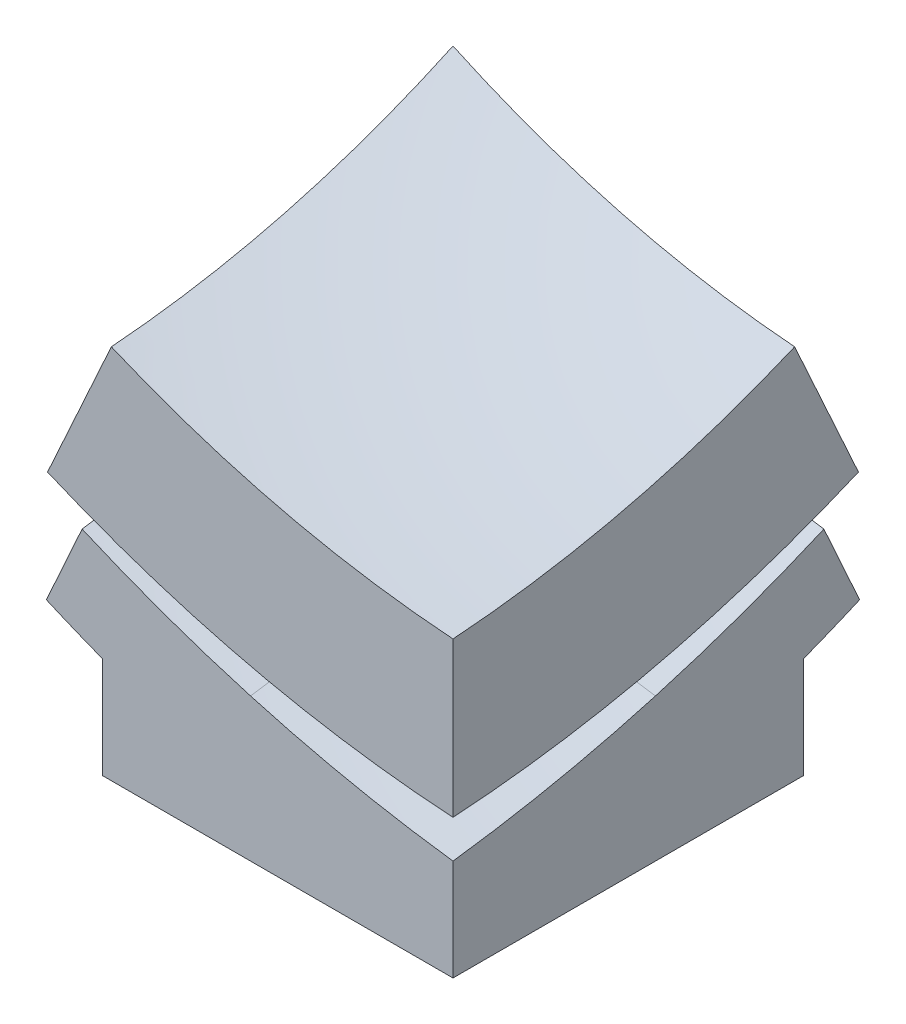
ISO-10303-21;
HEADER;
FILE_DESCRIPTION(('STEP AP214'),'2;1');
FILE_NAME('part.step','',(''),(''),'','','');
FILE_SCHEMA(('AUTOMOTIVE_DESIGN { 1 0 10303 214 1 1 1 1 }'));
ENDSEC;
DATA;
#1=APPLICATION_CONTEXT('core data for automotive mechanical design processes');
#2=APPLICATION_PROTOCOL_DEFINITION('international standard','automotive_design',2000,#1);
#3=PRODUCT_CONTEXT('',#1,'mechanical');
#4=PRODUCT('Part','Part','',(#3));
#5=PRODUCT_RELATED_PRODUCT_CATEGORY('part','',(#4));
#6=PRODUCT_DEFINITION_FORMATION('','',#4);
#7=PRODUCT_DEFINITION_CONTEXT('part definition',#1,'design');
#8=PRODUCT_DEFINITION('design','',#6,#7);
#9=PRODUCT_DEFINITION_SHAPE('','',#8);
#10=(LENGTH_UNIT() NAMED_UNIT(*) SI_UNIT(.MILLI.,.METRE.));
#11=(NAMED_UNIT(*) PLANE_ANGLE_UNIT() SI_UNIT($,.RADIAN.));
#12=(NAMED_UNIT(*) SI_UNIT($,.STERADIAN.) SOLID_ANGLE_UNIT());
#13=UNCERTAINTY_MEASURE_WITH_UNIT(LENGTH_MEASURE(1.E-05),#10,'distance_accuracy_value','');
#14=(GEOMETRIC_REPRESENTATION_CONTEXT(3) GLOBAL_UNCERTAINTY_ASSIGNED_CONTEXT((#13)) GLOBAL_UNIT_ASSIGNED_CONTEXT((#10,
#11,#12)) REPRESENTATION_CONTEXT('',''));
#15=CARTESIAN_POINT('',(0.,0.,0.));
#16=DIRECTION('',(0.,0.,1.));
#17=DIRECTION('',(1.,0.,0.));
#18=AXIS2_PLACEMENT_3D('',#15,#16,#17);
#19=CARTESIAN_POINT('',(32.5,0.,-3.894796058442));
#20=DIRECTION('',(0.,0.,-1.));
#21=DIRECTION('',(-1.,0.,0.));
#22=AXIS2_PLACEMENT_3D('',#19,#20,#21);
#23=PLANE('',#22);
#24=DIRECTION('',(1.,0.,0.));
#25=VECTOR('',#24,1.);
#26=CARTESIAN_POINT('',(-32.5,-32.5,-3.8947960584421));
#27=LINE('',#26,#25);
#28=CARTESIAN_POINT('',(-11.684388175326,-32.5,-3.89479605844216));
#29=VERTEX_POINT('',#28);
#30=CARTESIAN_POINT('',(-3.89479605844183,-32.5,-3.89479605844211));
#31=VERTEX_POINT('',#30);
#32=EDGE_CURVE('E387',#29,#31,#27,.T.);
#33=ORIENTED_EDGE('',*,*,#32,.T.);
#34=DIRECTION('',(0.,1.,0.));
#35=VECTOR('',#34,1.);
#36=CARTESIAN_POINT('',(-3.89479605844199,-1.11022302462516E-13,-3.89479605844199));
#37=LINE('',#36,#35);
#38=CARTESIAN_POINT('',(-3.89479605844188,-30.250298571471,-3.89479605844201));
#39=VERTEX_POINT('',#38);
#40=EDGE_CURVE('E213',#31,#39,#37,.T.);
#41=ORIENTED_EDGE('',*,*,#40,.T.);
#42=CARTESIAN_POINT('',(0.,0.,-3.8947960584419));
#43=DIRECTION('',(0.,0.,1.));
#44=DIRECTION('',(-1.,0.,0.));
#45=AXIS2_PLACEMENT_3D('',#42,#43,#44);
#46=CIRCLE('',#45,30.5);
#47=CARTESIAN_POINT('',(-8.39306295221711,-29.3224571664811,-3.894796058442));
#48=VERTEX_POINT('',#47);
#49=EDGE_CURVE('E424',#48,#39,#46,.T.);
#50=ORIENTED_EDGE('',*,*,#49,.F.);
#51=CARTESIAN_POINT('',(-12.1350869813756,-27.9819524685902,-3.894796058442));
#52=VERTEX_POINT('',#51);
#53=EDGE_CURVE('E56',#52,#48,#46,.T.);
#54=ORIENTED_EDGE('',*,*,#53,.F.);
#55=CARTESIAN_POINT('',(-29.416168466946,-66.051924374476,-3.89479605844222));
#56=CARTESIAN_POINT('',(-28.5696787732183,-64.1914749337505,-3.89479605844221));
#57=CARTESIAN_POINT('',(-27.7232825890568,-62.3309829328382,-3.89479605844221));
#58=CARTESIAN_POINT('',(-26.03075970847,-58.6098758727574,-3.8947960584422));
#59=CARTESIAN_POINT('',(-25.1846330121031,-56.7492608135623,-3.89479605844219));
#60=CARTESIAN_POINT('',(-23.4926532897825,-53.0276975058335,-3.89479605844218));
#61=CARTESIAN_POINT('',(-22.6468002965876,-51.1667492424052,-3.89479605844217));
#62=CARTESIAN_POINT('',(-20.9555808754597,-47.444632031876,-3.89479605844216));
#63=CARTESIAN_POINT('',(-20.1102144474377,-45.5834630848154,-3.89479605844215));
#64=CARTESIAN_POINT('',(-18.4474288131773,-41.9208435740423,-3.89479605844214));
#65=CARTESIAN_POINT('',(-17.6299876179329,-40.1194029946697,-3.89479605844213));
#66=CARTESIAN_POINT('',(-15.996066146622,-36.5160849066687,-3.89479605844212));
#67=CARTESIAN_POINT('',(-15.1795858710729,-34.7142073978057,-3.89479605844211));
#68=CARTESIAN_POINT('',(-13.5481833094952,-31.1099353467278,-3.8947960584421));
#69=CARTESIAN_POINT('',(-12.7332608943258,-29.3075408630017,-3.89479605844209));
#70=CARTESIAN_POINT('',(-11.5127940119983,-26.6030853138836,-3.89479605844209));
#71=CARTESIAN_POINT('',(-11.1062914123115,-25.701456688943,-3.89479605844209));
#72=CARTESIAN_POINT('',(-10.294163959412,-23.8978042768587,-3.89479605844208));
#73=CARTESIAN_POINT('',(-9.88853910602563,-22.9957804897932,-3.89479605844207));
#74=CARTESIAN_POINT('',(-9.2065032594189,-21.4763059578972,-3.89479605844207));
#75=CARTESIAN_POINT('',(-8.92976461995951,-20.8590023006085,-3.89479605844207));
#76=CARTESIAN_POINT('',(-8.37703383152,-19.6240594252027,-3.89479605844206));
#77=CARTESIAN_POINT('',(-8.1010416838933,-19.0064202064797,-3.89479605844206));
#78=CARTESIAN_POINT('',(-7.54998867786682,-17.7705812302609,-3.89479605844206));
#79=CARTESIAN_POINT('',(-7.27492801253324,-17.1523813866479,-3.89479605844205));
#80=CARTESIAN_POINT('',(-6.72614492656181,-15.9153915953327,-3.89479605844205));
#81=CARTESIAN_POINT('',(-6.45242249860284,-15.2966016508809,-3.89479605844205));
#82=CARTESIAN_POINT('',(-5.90253119033794,-14.0483793511478,-3.89479605844204));
#83=CARTESIAN_POINT('',(-5.62639230405676,-13.4189337749018,-3.89479605844204));
#84=CARTESIAN_POINT('',(-5.07694017830203,-12.1587905101018,-3.89479605844204));
#85=CARTESIAN_POINT('',(-4.80362700198999,-11.5280927939335,-3.89479605844204));
#86=CARTESIAN_POINT('',(-4.39705562614906,-10.5807744503386,-3.89479605844203));
#87=CARTESIAN_POINT('',(-4.26213163590385,-10.2648690731428,-3.89479605844203));
#88=CARTESIAN_POINT('',(-3.9937175640018,-9.63245013102209,-3.89479605844203));
#89=CARTESIAN_POINT('',(-3.8602274779844,-9.3159365679502,-3.89479605844203));
#90=CARTESIAN_POINT('',(-3.59511692405022,-8.68214009799741,-3.89479605844203));
#91=CARTESIAN_POINT('',(-3.46349638768511,-8.36485721978333,-3.89479605844203));
#92=CARTESIAN_POINT('',(-3.20273959693972,-7.72927362651039,-3.89479605844202));
#93=CARTESIAN_POINT('',(-3.07360331422213,-7.41097292310998,-3.89479605844201));
#94=CARTESIAN_POINT('',(-2.84971907337207,-6.85056137856179,-3.89479605844201));
#95=CARTESIAN_POINT('',(-2.75424368798602,-6.60874160902114,-3.89479605844202));
#96=CARTESIAN_POINT('',(-2.56581897830031,-6.12411397428643,-3.89479605844202));
#97=CARTESIAN_POINT('',(-2.47286968797718,-5.88130609585254,-3.89479605844202));
#98=CARTESIAN_POINT('',(-2.29017335188116,-5.39412272153227,-3.89479605844201));
#99=CARTESIAN_POINT('',(-2.20043061525618,-5.14974560104221,-3.89479605844201));
#100=CARTESIAN_POINT('',(-2.02540920235413,-4.65940193632091,-3.89479605844201));
#101=CARTESIAN_POINT('',(-1.94013043417602,-4.41343542492814,-3.89479605844201));
#102=CARTESIAN_POINT('',(-1.7774210408831,-3.92476384032164,-3.89479605844201));
#103=CARTESIAN_POINT('',(-1.69986081019384,-3.6821028545553,-3.89479605844201));
#104=CARTESIAN_POINT('',(-1.5527459494066,-3.19439417637026,-3.89479605844201));
#105=CARTESIAN_POINT('',(-1.48319256853288,-2.94934611797307,-3.89479605844201));
#106=CARTESIAN_POINT('',(-1.29121997295478,-2.21058453377259,-3.894796058442));
#107=CARTESIAN_POINT('',(-1.1850489051159,-1.71202481987181,-3.894796058442));
#108=CARTESIAN_POINT('',(-1.09675602170218,-1.0582140694873,-3.894796058442));
#109=CARTESIAN_POINT('',(-1.07987082818217,-0.907619335426684,-3.894796058442));
#110=CARTESIAN_POINT('',(-1.05363329741733,-0.605766719669173,-3.894796058442));
#111=CARTESIAN_POINT('',(-1.04428061415988,-0.454508868754105,-3.894796058442));
#112=CARTESIAN_POINT('',(-1.03357665185032,-0.151804059439717,-3.894796058442));
#113=CARTESIAN_POINT('',(-1.03222025175548,-0.000357284214848905,-3.894796058442));
#114=CARTESIAN_POINT('',(-1.03756621336806,0.302394996942093,-3.894796058442));
#115=CARTESIAN_POINT('',(-1.04426874304767,0.453700499863845,-3.894796058442));
#116=CARTESIAN_POINT('',(-1.06549522364486,0.757257201279924,-3.89479605844199));
#117=CARTESIAN_POINT('',(-1.08009586120967,0.909502956287994,-3.89479605844199));
#118=CARTESIAN_POINT('',(-1.1164773659674,1.2131265204791,-3.89479605844199));
#119=CARTESIAN_POINT('',(-1.1382584699866,1.36450430086701,-3.89479605844199));
#120=CARTESIAN_POINT('',(-1.18814621018949,1.66638179899678,-3.89479605844199));
#121=CARTESIAN_POINT('',(-1.21626013635239,1.8168802980814,-3.89479605844199));
#122=CARTESIAN_POINT('',(-1.27787097458574,2.11674748754781,-3.89479605844199));
#123=CARTESIAN_POINT('',(-1.31136750560646,2.26611625712315,-3.89479605844198));
#124=CARTESIAN_POINT('',(-1.41647248406715,2.70378110187293,-3.89479605844197));
#125=CARTESIAN_POINT('',(-1.49429042233705,2.99058289178585,-3.89479605844198));
#126=CARTESIAN_POINT('',(-1.66157857542586,3.56079750925627,-3.89479605844199));
#127=CARTESIAN_POINT('',(-1.75105337888936,3.84420895400656,-3.89479605844198));
#128=CARTESIAN_POINT('',(-1.93815959710848,4.4086997399001,-3.89479605844198));
#129=CARTESIAN_POINT('',(-2.0358011051953,4.6897757087522,-3.89479605844198));
#130=CARTESIAN_POINT('',(-2.23672525169335,5.24983889934672,-3.89479605844198));
#131=CARTESIAN_POINT('',(-2.3400070238088,5.52882643441164,-3.89479605844198));
#132=CARTESIAN_POINT('',(-2.55093928257786,6.08606039014571,-3.89479605844198));
#133=CARTESIAN_POINT('',(-2.65860152885465,6.36430234094777,-3.89479605844197));
#134=CARTESIAN_POINT('',(-2.87693529765561,6.91960933416568,-3.89479605844197));
#135=CARTESIAN_POINT('',(-2.98760691470981,7.19667433929462,-3.89479605844197));
#136=CARTESIAN_POINT('',(-3.21112896098946,7.74968826211712,-3.89479605844197));
#137=CARTESIAN_POINT('',(-3.32397775032738,8.02563784397576,-3.89479605844197));
#138=CARTESIAN_POINT('',(-3.55141334845528,8.57682052041555,-3.89479605844197));
#139=CARTESIAN_POINT('',(-3.66600016713014,8.85205361091129,-3.89479605844197));
#140=CARTESIAN_POINT('',(-4.01515252354366,9.68496332917358,-3.89479605844196));
#141=CARTESIAN_POINT('',(-4.25181234200664,10.2417614551849,-3.89479605844196));
#142=CARTESIAN_POINT('',(-4.72867564152757,11.3539515824088,-3.89479605844196));
#143=CARTESIAN_POINT('',(-4.96887975611874,11.9093433109255,-3.89479605844196));
#144=CARTESIAN_POINT('',(-5.45118798019799,13.0179935034946,-3.89479605844195));
#145=CARTESIAN_POINT('',(-5.69328738899587,13.5712540141217,-3.89479605844195));
#146=CARTESIAN_POINT('',(-6.17914507001119,14.6770071380306,-3.89479605844194));
#147=CARTESIAN_POINT('',(-6.42290324544915,15.2294997938856,-3.89479605844194));
#148=CARTESIAN_POINT('',(-7.14525253093444,16.8619299310355,-3.89479605844193));
#149=CARTESIAN_POINT('',(-7.62554398141962,17.9411146784307,-3.89479605844193));
#150=CARTESIAN_POINT('',(-8.58878813998687,20.0982964017412,-3.89479605844193));
#151=CARTESIAN_POINT('',(-9.07174085373026,21.1762933751241,-3.89479605844192));
#152=CARTESIAN_POINT('',(-10.0393671259777,23.3315491653835,-3.89479605844191));
#153=CARTESIAN_POINT('',(-10.5240407301328,24.4088079617599,-3.89479605844191));
#154=CARTESIAN_POINT('',(-11.4945392064809,26.5628053818308,-3.8947960584419));
#155=CARTESIAN_POINT('',(-11.9803640776021,27.6395440060083,-3.8947960584419));
#156=CARTESIAN_POINT('',(-13.4398921653654,30.871119169615,-3.89479605844189));
#157=CARTESIAN_POINT('',(-14.4147938215244,33.0254143461704,-3.89479605844188));
#158=CARTESIAN_POINT('',(-16.3663156861894,37.3332024631929,-3.89479605844187));
#159=CARTESIAN_POINT('',(-17.3429358792931,39.4866954106426,-3.89479605844186));
#160=CARTESIAN_POINT('',(-19.2439382790821,43.6757264797442,-3.89479605844184));
#161=CARTESIAN_POINT('',(-20.1682636997775,45.711290372279,-3.89479605844184));
#162=CARTESIAN_POINT('',(-22.0175547388455,49.7821344800527,-3.89479605844182));
#163=CARTESIAN_POINT('',(-22.9425203590859,51.8174146944429,-3.89479605844181));
#164=CARTESIAN_POINT('',(-24.79208443011,55.8859862634333,-3.8947960584418));
#165=CARTESIAN_POINT('',(-25.7166824904327,57.9192777955463,-3.8947960584418));
#166=CARTESIAN_POINT('',(-27.5662068794774,61.9857042053012,-3.89479605844178));
#167=CARTESIAN_POINT('',(-28.4911332072075,64.0188390833942,-3.89479605844176));
#168=CARTESIAN_POINT('',(-29.4161684669464,66.051924374476,-3.89479605844173));
#169=B_SPLINE_CURVE_WITH_KNOTS('',3,(#55,#56,#57,#58,#59,#60,#61,#62,#63,#64,#65,#66,#67,#68,
#69,#70,#71,#72,#73,#74,#75,#76,#77,#78,#79,#80,#81,#82,#83,#84,#85,#86,#87,#88,#89,#90,#91,#92,
#93,#94,#95,#96,#97,#98,#99,#100,#101,#102,#103,#104,#105,#106,#107,#108,#109,#110,#111,#112,
#113,#114,#115,#116,#117,#118,#119,#120,#121,#122,#123,#124,#125,#126,#127,#128,#129,#130,#131,
#132,#133,#134,#135,#136,#137,#138,#139,#140,#141,#142,#143,#144,#145,#146,#147,#148,#149,#150,
#151,#152,#153,#154,#155,#156,#157,#158,#159,#160,#161,#162,#163,#164,#165,#166,#167,#168),
.UNSPECIFIED.,.F.,.F.,(4,2,2,2,2,2,2,2,2,2,2,2,2,2,2,2,2,2,2,2,2,2,2,2,2,2,2,2,2,2,2,2,2,2,2,2,
2,2,2,2,2,2,2,2,2,2,2,2,2,2,2,2,2,2,2,2,4),(0.,6.13191263071141,12.2638265880686,
18.3963106603102,24.5287936114384,30.4634866899368,36.3981829617424,42.3323638553777,
45.2994508242491,48.2665372060903,50.2960276001445,52.3255216712729,54.3554133885142,
56.3852939883497,58.4473498447436,60.5094516938944,61.5399859805238,62.570517132376,
63.6010104564648,64.631492018981,65.4114370711576,66.1913926085809,66.9723596297797,
67.7533105666495,68.5174167016017,69.2816418908572,70.8061823856955,71.260637497765,
71.7150717328409,72.1692149039164,72.6233675408576,73.0820110610093,73.5406697096636,
73.9998590626092,74.4590159225591,75.3501155813301,76.2415670812324,77.1341370953014,
78.0265704018055,78.9215820497974,79.8166218443501,80.7110119404228,81.6054071251626,
83.4204020151843,85.235725358136,87.0474562684902,88.8590823658953,92.4027841811937,
95.9464935379284,99.4902976137308,103.034098391713,110.127952310092,117.221742970938,
123.928536398413,130.635349476756,137.336275068786,144.037180582453),.UNSPECIFIED.);
#170=CARTESIAN_POINT('',(-12.929011806916,-29.7396392780992,-3.89479605844209));
#171=VERTEX_POINT('',#170);
#172=EDGE_CURVE('E110',#171,#52,#169,.T.);
#173=ORIENTED_EDGE('',*,*,#172,.F.);
#174=CARTESIAN_POINT('',(0.,0.,-3.89479605844199));
#175=DIRECTION('',(0.,0.,-1.));
#176=DIRECTION('',(0.,1.,0.));
#177=AXIS2_PLACEMENT_3D('',#174,#175,#176);
#178=CIRCLE('',#177,32.4284672887085);
#179=CARTESIAN_POINT('',(-11.6843881753259,-30.250298571471,-3.8947960584421));
#180=VERTEX_POINT('',#179);
#181=EDGE_CURVE('E101',#180,#171,#178,.T.);
#182=ORIENTED_EDGE('',*,*,#181,.F.);
#183=DIRECTION('',(0.,1.,0.));
#184=VECTOR('',#183,1.);
#185=CARTESIAN_POINT('',(-11.6843881753261,-1.45716771982052E-13,-3.89479605844199));
#186=LINE('',#185,#184);
#187=EDGE_CURVE('E111',#29,#180,#186,.T.);
#188=ORIENTED_EDGE('',*,*,#187,.F.);
#189=EDGE_LOOP('',(#33,#41,#50,#54,#173,#182,#188));
#190=FACE_BOUND('',#189,.T.);
#191=ADVANCED_FACE('F37',(#190),#23,.F.);
#192=CARTESIAN_POINT('',(-3.8947960584421,32.5,0.));
#193=DIRECTION('',(-1.,0.,0.));
#194=DIRECTION('',(0.,-1.,0.));
#195=AXIS2_PLACEMENT_3D('',#192,#193,#194);
#196=PLANE('',#195);
#197=DIRECTION('',(0.,0.,-1.));
#198=VECTOR('',#197,1.);
#199=CARTESIAN_POINT('',(-3.89479605844187,-32.5,-32.5));
#200=LINE('',#199,#198);
#201=CARTESIAN_POINT('',(-3.89479605844187,-32.5,-11.6843881753262));
#202=VERTEX_POINT('',#201);
#203=EDGE_CURVE('E229',#31,#202,#200,.T.);
#204=ORIENTED_EDGE('',*,*,#203,.T.);
#205=DIRECTION('',(0.,1.,0.));
#206=VECTOR('',#205,1.);
#207=CARTESIAN_POINT('',(-3.89479605844198,0.,-11.6843881753261));
#208=LINE('',#207,#206);
#209=CARTESIAN_POINT('',(-3.89479605844188,-30.2502985714709,-11.6843881753262));
#210=VERTEX_POINT('',#209);
#211=EDGE_CURVE('E482',#202,#210,#208,.T.);
#212=ORIENTED_EDGE('',*,*,#211,.T.);
#213=CARTESIAN_POINT('',(-3.89479605844199,0.,0.));
#214=DIRECTION('',(-1.,0.,0.));
#215=DIRECTION('',(0.,-1.,0.));
#216=AXIS2_PLACEMENT_3D('',#213,#214,#215);
#217=CIRCLE('',#216,32.4284672887085);
#218=CARTESIAN_POINT('',(-3.89479605844189,-29.7396392780992,-12.9290118069162));
#219=VERTEX_POINT('',#218);
#220=EDGE_CURVE('E78',#210,#219,#217,.F.);
#221=ORIENTED_EDGE('',*,*,#220,.T.);
#222=CARTESIAN_POINT('',(-3.89479605844186,-35.5699771913843,-15.5675463428581));
#223=CARTESIAN_POINT('',(-3.89479605844186,-34.2887705066437,-14.9870911520038));
#224=CARTESIAN_POINT('',(-3.89479605844186,-33.0074458102986,-14.4068959176566));
#225=CARTESIAN_POINT('',(-3.89479605844187,-30.4444005461585,-13.2473845634317));
#226=CARTESIAN_POINT('',(-3.89479605844187,-29.1626799788236,-12.6680684425371));
#227=CARTESIAN_POINT('',(-3.89479605844189,-26.5986790761797,-11.510672682373));
#228=CARTESIAN_POINT('',(-3.89479605844189,-25.3163987403987,-10.9325930441481));
#229=CARTESIAN_POINT('',(-3.8947960584419,-23.3923252593333,-10.0669226868518));
#230=CARTESIAN_POINT('',(-3.8947960584419,-22.7508582328739,-9.77860725201842));
#231=CARTESIAN_POINT('',(-3.8947960584419,-21.4676400043881,-9.20260894604736));
#232=CARTESIAN_POINT('',(-3.89479605844191,-20.8258888022636,-8.9149260751281));
#233=CARTESIAN_POINT('',(-3.89479605844192,-20.183962352535,-8.62763429495583));
#234=B_SPLINE_CURVE_WITH_KNOTS('',3,(#222,#223,#224,#225,#226,#227,#228,#229,#230,#231,#232,
#233),.UNSPECIFIED.,.F.,.F.,(4,2,2,2,2,4),(0.,4.21968855813473,8.43937223157972,
12.6590594690263,14.7689055196009,16.8787522985041),.UNSPECIFIED.);
#235=CARTESIAN_POINT('',(-3.8947960584418,-27.9819524685902,-12.1350869813758));
#236=VERTEX_POINT('',#235);
#237=EDGE_CURVE('E231',#219,#236,#234,.T.);
#238=ORIENTED_EDGE('',*,*,#237,.T.);
#239=CARTESIAN_POINT('',(-3.8947960584419,0.,0.));
#240=DIRECTION('',(-1.,0.,0.));
#241=DIRECTION('',(0.,-1.,0.));
#242=AXIS2_PLACEMENT_3D('',#239,#240,#241);
#243=CIRCLE('',#242,30.5);
#244=CARTESIAN_POINT('',(-3.89479605844189,-29.322457166481,-8.39306295221732));
#245=VERTEX_POINT('',#244);
#246=EDGE_CURVE('E41',#236,#245,#243,.T.);
#247=ORIENTED_EDGE('',*,*,#246,.T.);
#248=CARTESIAN_POINT('',(-3.89479605844199,0.,0.));
#249=DIRECTION('',(-1.,0.,0.));
#250=DIRECTION('',(0.,-1.,0.));
#251=AXIS2_PLACEMENT_3D('',#248,#249,#250);
#252=CIRCLE('',#251,30.5);
#253=EDGE_CURVE('E409',#39,#245,#252,.F.);
#254=ORIENTED_EDGE('',*,*,#253,.F.);
#255=ORIENTED_EDGE('',*,*,#40,.F.);
#256=EDGE_LOOP('',(#204,#212,#221,#238,#247,#254,#255));
#257=FACE_BOUND('',#256,.T.);
#258=ADVANCED_FACE('F238',(#257),#196,.F.);
#259=CARTESIAN_POINT('',(0.,0.,0.));
#260=DIRECTION('',(0.,0.,-1.));
#261=DIRECTION('',(1.,0.,0.));
#262=AXIS2_PLACEMENT_3D('',#259,#260,#261);
#263=SPHERICAL_SURFACE('',#262,30.7476736735782);
#264=CARTESIAN_POINT('',(-8.39306295221722,0.,0.));
#265=DIRECTION('',(1.,0.,0.));
#266=DIRECTION('',(0.,1.,0.));
#267=AXIS2_PLACEMENT_3D('',#264,#265,#266);
#268=CIRCLE('',#267,29.5799920658707);
#269=CARTESIAN_POINT('',(-8.39306295221712,-28.3642807928756,-8.39306295221731));
#270=VERTEX_POINT('',#269);
#271=EDGE_CURVE('E212',#48,#270,#268,.T.);
#272=ORIENTED_EDGE('',*,*,#271,.T.);
#273=CARTESIAN_POINT('',(0.,0.,-8.39306295221722));
#274=DIRECTION('',(0.,0.,1.));
#275=DIRECTION('',(-1.,0.,0.));
#276=AXIS2_PLACEMENT_3D('',#273,#274,#275);
#277=CIRCLE('',#276,29.5799920658706);
#278=CARTESIAN_POINT('',(-12.1350869813757,-26.9762042283828,-8.39306295221731));
#279=VERTEX_POINT('',#278);
#280=EDGE_CURVE('E419',#279,#270,#277,.T.);
#281=ORIENTED_EDGE('',*,*,#280,.F.);
#282=CARTESIAN_POINT('',(-12.1350869813758,0.,0.));
#283=DIRECTION('',(1.,0.,0.));
#284=DIRECTION('',(0.,1.,0.));
#285=AXIS2_PLACEMENT_3D('',#282,#283,#284);
#286=CIRCLE('',#285,28.2517096879339);
#287=EDGE_CURVE('E228',#52,#279,#286,.T.);
#288=ORIENTED_EDGE('',*,*,#287,.F.);
#289=ORIENTED_EDGE('',*,*,#53,.T.);
#290=EDGE_LOOP('',(#272,#281,#288,#289));
#291=FACE_BOUND('',#290,.T.);
#292=ADVANCED_FACE('F242',(#291),#263,.F.);
#293=ORIENTED_EDGE('',*,*,#49,.T.);
#294=ORIENTED_EDGE('',*,*,#253,.T.);
#295=EDGE_CURVE('E422',#270,#245,#277,.T.);
#296=ORIENTED_EDGE('',*,*,#295,.F.);
#297=ORIENTED_EDGE('',*,*,#271,.F.);
#298=EDGE_LOOP('',(#293,#294,#296,#297));
#299=FACE_BOUND('',#298,.T.);
#300=ADVANCED_FACE('F246',(#299),#263,.F.);
#301=CARTESIAN_POINT('',(0.,0.,0.));
#302=DIRECTION('',(-1.,0.,0.));
#303=DIRECTION('',(0.,1.,0.));
#304=AXIS2_PLACEMENT_3D('',#301,#302,#303);
#305=SPHERICAL_SURFACE('',#304,30.7476736735782);
#306=CARTESIAN_POINT('',(0.,0.,-12.1350869813757));
#307=DIRECTION('',(0.,0.,1.));
#308=DIRECTION('',(0.,-1.,0.));
#309=AXIS2_PLACEMENT_3D('',#306,#307,#308);
#310=CIRCLE('',#309,28.2517096879339);
#311=CARTESIAN_POINT('',(-8.39306295221712,-26.9762042283827,-12.1350869813758));
#312=VERTEX_POINT('',#311);
#313=EDGE_CURVE('E237',#236,#312,#310,.F.);
#314=ORIENTED_EDGE('',*,*,#313,.T.);
#315=CARTESIAN_POINT('',(-8.39306295221721,0.,0.));
#316=DIRECTION('',(-1.,0.,0.));
#317=DIRECTION('',(0.,-1.,0.));
#318=AXIS2_PLACEMENT_3D('',#315,#316,#317);
#319=CIRCLE('',#318,29.5799920658706);
#320=EDGE_CURVE('E430',#312,#270,#319,.T.);
#321=ORIENTED_EDGE('',*,*,#320,.T.);
#322=ORIENTED_EDGE('',*,*,#295,.T.);
#323=ORIENTED_EDGE('',*,*,#246,.F.);
#324=EDGE_LOOP('',(#314,#321,#322,#323));
#325=FACE_BOUND('',#324,.T.);
#326=ADVANCED_FACE('F192',(#325),#305,.F.);
#327=CARTESIAN_POINT('',(-1.70874488464033,23.8515645548495,0.));
#328=DIRECTION('',(-1.,0.,0.));
#329=DIRECTION('',(0.,-1.,0.));
#330=AXIS2_PLACEMENT_3D('',#327,#328,#329);
#331=PLANE('',#330);
#332=CARTESIAN_POINT('',(-1.70874488464012,-34.9607896136189,-15.2120097278831));
#333=CARTESIAN_POINT('',(-1.70874488464013,-33.1023837783201,-14.3660313579579));
#334=CARTESIAN_POINT('',(-1.70874488464013,-31.2439486676821,-13.5201170489049));
#335=CARTESIAN_POINT('',(-1.70874488464014,-27.5268676857756,-11.8287533360436));
#336=CARTESIAN_POINT('',(-1.70874488464015,-25.6682218145793,-10.9833039320765));
#337=CARTESIAN_POINT('',(-1.70874488464016,-22.8799793916311,-9.71573046059177));
#338=CARTESIAN_POINT('',(-1.70874488464017,-21.9505194295402,-9.29330597665985));
#339=CARTESIAN_POINT('',(-1.70874488464017,-20.0914624460492,-8.44875889267145));
#340=CARTESIAN_POINT('',(-1.70874488464018,-19.1618654246603,-8.02663629259033));
#341=CARTESIAN_POINT('',(-1.70874488464018,-17.3024651297722,-7.18284448846478));
#342=CARTESIAN_POINT('',(-1.70874488464019,-16.3726618561919,-6.76117528459898));
#343=CARTESIAN_POINT('',(-1.70874488464019,-14.9777033655112,-6.12923082475437));
#344=CARTESIAN_POINT('',(-1.70874488464019,-14.5126748754531,-5.9186758672681));
#345=CARTESIAN_POINT('',(-1.7087448846402,-13.5825022899432,-5.49782134100693));
#346=CARTESIAN_POINT('',(-1.7087448846402,-13.1173581944784,-5.28752177226072));
#347=CARTESIAN_POINT('',(-1.7087448846402,-12.6521407882195,-5.07738438199868));
#348=B_SPLINE_CURVE_WITH_KNOTS('',3,(#332,#333,#334,#335,#336,#337,#338,#339,#340,#341,#342,
#343,#344,#345,#346,#347),.UNSPECIFIED.,.F.,.F.,(4,2,2,2,2,2,2,4),(0.,6.12569726313187,
12.2513924350889,15.3142414603477,18.3770902354798,21.439940216796,22.9713656230257,
24.5027912012693),.UNSPECIFIED.);
#349=CARTESIAN_POINT('',(-1.70874488464016,-25.0830173476926,-10.717340336918));
#350=VERTEX_POINT('',#349);
#351=CARTESIAN_POINT('',(-1.70874488464014,-21.9639871726437,-9.29948381331437));
#352=VERTEX_POINT('',#351);
#353=EDGE_CURVE('E502',#350,#352,#348,.T.);
#354=ORIENTED_EDGE('',*,*,#353,.T.);
#355=CARTESIAN_POINT('',(-1.70874488464021,0.,0.));
#356=DIRECTION('',(-1.,0.,0.));
#357=DIRECTION('',(0.,-1.,0.));
#358=AXIS2_PLACEMENT_3D('',#355,#356,#357);
#359=CIRCLE('',#358,23.8515645548495);
#360=CARTESIAN_POINT('',(-1.70874488464016,-23.7902779015582,-1.70874488464032));
#361=VERTEX_POINT('',#360);
#362=EDGE_CURVE('E396',#352,#361,#359,.T.);
#363=ORIENTED_EDGE('',*,*,#362,.T.);
#364=DIRECTION('',(0.,1.,0.));
#365=VECTOR('',#364,1.);
#366=CARTESIAN_POINT('',(-1.70874488464025,0.,-1.70874488464025));
#367=LINE('',#366,#365);
#368=CARTESIAN_POINT('',(-1.70874488464016,-27.2231396808155,-1.70874488464036));
#369=VERTEX_POINT('',#368);
#370=EDGE_CURVE('E87',#369,#361,#367,.T.);
#371=ORIENTED_EDGE('',*,*,#370,.F.);
#372=CARTESIAN_POINT('',(-1.70874488464025,0.,0.));
#373=DIRECTION('',(-1.,0.,0.));
#374=DIRECTION('',(0.,-1.,0.));
#375=AXIS2_PLACEMENT_3D('',#372,#373,#374);
#376=CIRCLE('',#375,27.2767143028991);
#377=CARTESIAN_POINT('',(-1.70874488464016,-26.2301254415013,-7.48329222234982));
#378=VERTEX_POINT('',#377);
#379=EDGE_CURVE('E404',#378,#369,#376,.T.);
#380=ORIENTED_EDGE('',*,*,#379,.F.);
#381=CARTESIAN_POINT('',(-1.70874488464027,0.,0.));
#382=DIRECTION('',(-1.,0.,0.));
#383=DIRECTION('',(0.,-1.,0.));
#384=AXIS2_PLACEMENT_3D('',#381,#382,#383);
#385=CIRCLE('',#384,27.276714302899);
#386=EDGE_CURVE('E425',#350,#378,#385,.T.);
#387=ORIENTED_EDGE('',*,*,#386,.F.);
#388=EDGE_LOOP('',(#354,#363,#371,#380,#387));
#389=FACE_BOUND('',#388,.T.);
#390=ADVANCED_FACE('F185',(#389),#331,.F.);
#391=CARTESIAN_POINT('',(0.,0.,0.));
#392=DIRECTION('',(-1.,0.,0.));
#393=DIRECTION('',(0.,1.,0.));
#394=AXIS2_PLACEMENT_3D('',#391,#392,#393);
#395=SPHERICAL_SURFACE('',#394,27.3301839042982);
#396=CARTESIAN_POINT('',(0.,0.,-10.7173403369179));
#397=DIRECTION('',(0.,0.,1.));
#398=DIRECTION('',(0.,-1.,0.));
#399=AXIS2_PLACEMENT_3D('',#396,#397,#398);
#400=CIRCLE('',#399,25.1411528841745);
#401=CARTESIAN_POINT('',(-7.48329222234964,-24.0016229838808,-10.717340336918));
#402=VERTEX_POINT('',#401);
#403=EDGE_CURVE('E504',#402,#350,#400,.T.);
#404=ORIENTED_EDGE('',*,*,#403,.T.);
#405=ORIENTED_EDGE('',*,*,#386,.T.);
#406=CARTESIAN_POINT('',(0.,0.,-7.48329222234974));
#407=DIRECTION('',(0.,0.,1.));
#408=DIRECTION('',(-1.,0.,0.));
#409=AXIS2_PLACEMENT_3D('',#406,#407,#408);
#410=CIRCLE('',#409,26.2857240675938);
#411=CARTESIAN_POINT('',(-7.48329222234964,-25.1980083989311,-7.48329222234982));
#412=VERTEX_POINT('',#411);
#413=EDGE_CURVE('E418',#412,#378,#410,.T.);
#414=ORIENTED_EDGE('',*,*,#413,.F.);
#415=CARTESIAN_POINT('',(-7.48329222234973,0.,0.));
#416=DIRECTION('',(-1.,0.,0.));
#417=DIRECTION('',(0.,-1.,0.));
#418=AXIS2_PLACEMENT_3D('',#415,#416,#417);
#419=CIRCLE('',#418,26.2857240675938);
#420=EDGE_CURVE('E428',#402,#412,#419,.T.);
#421=ORIENTED_EDGE('',*,*,#420,.F.);
#422=EDGE_LOOP('',(#404,#405,#414,#421));
#423=FACE_BOUND('',#422,.T.);
#424=ADVANCED_FACE('F181',(#423),#395,.T.);
#425=CARTESIAN_POINT('',(-7.48329222234973,0.,0.));
#426=DIRECTION('',(-1.,0.,0.));
#427=DIRECTION('',(0.,-1.,0.));
#428=AXIS2_PLACEMENT_3D('',#425,#426,#427);
#429=CONICAL_SURFACE('',#428,26.2857240675938,1.30134475047002);
#430=CARTESIAN_POINT('',(-8.39326295221711,-26.9768581268495,-12.135398644137));
#431=CARTESIAN_POINT('',(-8.24156328674934,-26.4808781488638,-11.8990033389355));
#432=CARTESIAN_POINT('',(-8.08986589319325,-25.9848974028044,-11.6626081873433));
#433=CARTESIAN_POINT('',(-7.7864756499041,-24.9929343745372,-11.1898181913767));
#434=CARTESIAN_POINT('',(-7.63478280017103,-24.4969520923293,-10.9534233470024));
#435=CARTESIAN_POINT('',(-7.48309222234964,-24.0009690420478,-10.7170286562373));
#436=B_SPLINE_CURVE_WITH_KNOTS('',3,(#430,#431,#432,#433,#434,#435),.UNSPECIFIED.,.F.,.F.,(4,2,
4),(0.,1.70997807188479,3.41995614377317),.UNSPECIFIED.);
#437=EDGE_CURVE('E195',#312,#402,#436,.T.);
#438=ORIENTED_EDGE('',*,*,#437,.T.);
#439=ORIENTED_EDGE('',*,*,#420,.T.);
#440=CARTESIAN_POINT('',(-8.39326295221711,-28.3649768493335,-8.39326295221731));
#441=CARTESIAN_POINT('',(-8.24156724531595,-27.837033100136,-8.24156724531615));
#442=CARTESIAN_POINT('',(-8.08987183104308,-27.3090891827758,-8.08987183104328));
#443=CARTESIAN_POINT('',(-7.78648158775392,-26.2532010117295,-7.78648158775411));
#444=CARTESIAN_POINT('',(-7.63478675873763,-25.7252567580436,-7.63478675873782));
#445=CARTESIAN_POINT('',(-7.48309222234963,-25.1973123361948,-7.48309222234981));
#446=B_SPLINE_CURVE_WITH_KNOTS('',3,(#440,#441,#442,#443,#444,#445),.UNSPECIFIED.,.F.,.F.,(4,2,
4),(0.,1.70959936701698,3.41919873403409),.UNSPECIFIED.);
#447=EDGE_CURVE('E203',#270,#412,#446,.T.);
#448=ORIENTED_EDGE('',*,*,#447,.F.);
#449=ORIENTED_EDGE('',*,*,#320,.F.);
#450=EDGE_LOOP('',(#438,#439,#448,#449));
#451=FACE_BOUND('',#450,.T.);
#452=ADVANCED_FACE('F184',(#451),#429,.T.);
#453=CARTESIAN_POINT('',(0.,0.,-7.48329222234974));
#454=DIRECTION('',(0.,0.,-1.));
#455=DIRECTION('',(-1.,0.,0.));
#456=AXIS2_PLACEMENT_3D('',#453,#454,#455);
#457=CONICAL_SURFACE('',#456,26.2857240675938,1.30134475047002);
#458=ORIENTED_EDGE('',*,*,#447,.T.);
#459=CARTESIAN_POINT('',(-10.7173403369178,-24.0016229838808,-7.48329222234981));
#460=VERTEX_POINT('',#459);
#461=EDGE_CURVE('E415',#460,#412,#410,.T.);
#462=ORIENTED_EDGE('',*,*,#461,.F.);
#463=CARTESIAN_POINT('',(-12.1353986441367,-26.9768581268492,-8.39326295221721));
#464=CARTESIAN_POINT('',(-11.8990033389352,-26.4808781488636,-8.24156328674944));
#465=CARTESIAN_POINT('',(-11.6626081873429,-25.9848974028042,-8.08986589319335));
#466=CARTESIAN_POINT('',(-11.1898181913764,-24.992934374537,-7.78647564990419));
#467=CARTESIAN_POINT('',(-10.9534233470021,-24.4969520923291,-7.63478280017112));
#468=CARTESIAN_POINT('',(-10.717028656237,-24.0009690420475,-7.48309222234973));
#469=B_SPLINE_CURVE_WITH_KNOTS('',3,(#463,#464,#465,#466,#467,#468),.UNSPECIFIED.,.F.,.F.,(4,2,
4),(0.,1.70997807188479,3.41995614377316),.UNSPECIFIED.);
#470=EDGE_CURVE('E221',#279,#460,#469,.T.);
#471=ORIENTED_EDGE('',*,*,#470,.F.);
#472=ORIENTED_EDGE('',*,*,#280,.T.);
#473=EDGE_LOOP('',(#458,#462,#471,#472));
#474=FACE_BOUND('',#473,.T.);
#475=ADVANCED_FACE('F190',(#474),#457,.T.);
#476=CARTESIAN_POINT('',(0.,0.,0.));
#477=DIRECTION('',(0.,0.,-1.));
#478=DIRECTION('',(1.,0.,0.));
#479=AXIS2_PLACEMENT_3D('',#476,#477,#478);
#480=SPHERICAL_SURFACE('',#479,27.3301839042982);
#481=CARTESIAN_POINT('',(-7.48329222234974,0.,0.));
#482=DIRECTION('',(1.,0.,0.));
#483=DIRECTION('',(0.,1.,0.));
#484=AXIS2_PLACEMENT_3D('',#481,#482,#483);
#485=CIRCLE('',#484,26.2857240675939);
#486=CARTESIAN_POINT('',(-7.48329222234964,-26.2301254415014,-1.70874488464036));
#487=VERTEX_POINT('',#486);
#488=EDGE_CURVE('E211',#412,#487,#485,.F.);
#489=ORIENTED_EDGE('',*,*,#488,.T.);
#490=CARTESIAN_POINT('',(0.,0.,-1.70874488464027));
#491=DIRECTION('',(0.,0.,1.));
#492=DIRECTION('',(-1.,0.,0.));
#493=AXIS2_PLACEMENT_3D('',#490,#491,#492);
#494=CIRCLE('',#493,27.276714302899);
#495=CARTESIAN_POINT('',(-10.7173403369178,-25.0830173476927,-1.70874488464035));
#496=VERTEX_POINT('',#495);
#497=EDGE_CURVE('E412',#496,#487,#494,.T.);
#498=ORIENTED_EDGE('',*,*,#497,.F.);
#499=CARTESIAN_POINT('',(-10.7173403369179,0.,0.));
#500=DIRECTION('',(1.,0.,0.));
#501=DIRECTION('',(0.,1.,0.));
#502=AXIS2_PLACEMENT_3D('',#499,#500,#501);
#503=CIRCLE('',#502,25.1411528841745);
#504=EDGE_CURVE('E168',#460,#496,#503,.F.);
#505=ORIENTED_EDGE('',*,*,#504,.F.);
#506=ORIENTED_EDGE('',*,*,#461,.T.);
#507=EDGE_LOOP('',(#489,#498,#505,#506));
#508=FACE_BOUND('',#507,.T.);
#509=ADVANCED_FACE('F178',(#508),#480,.T.);
#510=CARTESIAN_POINT('',(23.8515645548495,0.,-1.70874488464026));
#511=DIRECTION('',(0.,0.,-1.));
#512=DIRECTION('',(-1.,0.,0.));
#513=AXIS2_PLACEMENT_3D('',#510,#511,#512);
#514=PLANE('',#513);
#515=ORIENTED_EDGE('',*,*,#370,.T.);
#516=CARTESIAN_POINT('',(0.,0.,-1.70874488464023));
#517=DIRECTION('',(0.,0.,1.));
#518=DIRECTION('',(-1.,0.,0.));
#519=AXIS2_PLACEMENT_3D('',#516,#517,#518);
#520=CIRCLE('',#519,23.8515645548495);
#521=CARTESIAN_POINT('',(-9.29948381331422,-21.9639871726438,-1.7087448846403));
#522=VERTEX_POINT('',#521);
#523=EDGE_CURVE('E500',#522,#361,#520,.T.);
#524=ORIENTED_EDGE('',*,*,#523,.F.);
#525=CARTESIAN_POINT('',(-26.653641021208,-60.0813349897139,-1.70874488464046));
#526=CARTESIAN_POINT('',(-25.1459035069966,-56.7719488427378,-1.70874488464045));
#527=CARTESIAN_POINT('',(-23.6382126743882,-53.4625414279244,-1.70874488464043));
#528=CARTESIAN_POINT('',(-20.6231053336232,-46.8435382818547,-1.70874488464041));
#529=CARTESIAN_POINT('',(-19.115688830195,-43.5339425484445,-1.7087448846404));
#530=CARTESIAN_POINT('',(-16.0871738103604,-36.8833716162299,-1.70874488464038));
#531=CARTESIAN_POINT('',(-14.5660800513902,-33.5423942504371,-1.70874488464037));
#532=CARTESIAN_POINT('',(-12.2854001197433,-28.5305226123633,-1.70874488464035));
#533=CARTESIAN_POINT('',(-11.5253395450963,-26.859844226399,-1.70874488464034));
#534=CARTESIAN_POINT('',(-10.0057668453016,-23.5182381717281,-1.70874488464033));
#535=CARTESIAN_POINT('',(-9.24625472009753,-21.8473105030471,-1.70874488464033));
#536=CARTESIAN_POINT('',(-7.97719300239637,-19.0529889971123,-1.70874488464032));
#537=CARTESIAN_POINT('',(-7.46734885554232,-17.9297289392324,-1.70874488464031));
#538=CARTESIAN_POINT('',(-6.44846811955513,-15.6827935484942,-1.7087448846403));
#539=CARTESIAN_POINT('',(-5.93943156018946,-14.559118202128,-1.7087448846403));
#540=CARTESIAN_POINT('',(-5.17820427491975,-12.8755021855443,-1.7087448846403));
#541=CARTESIAN_POINT('',(-4.92540161916658,-12.3158382522818,-1.70874488464029));
#542=CARTESIAN_POINT('',(-4.42040553819602,-11.1962341268132,-1.70874488464029));
#543=CARTESIAN_POINT('',(-4.16821211418624,-10.6362939340621,-1.70874488464029));
#544=CARTESIAN_POINT('',(-3.6648055914068,-9.51604522772455,-1.70874488464028));
#545=CARTESIAN_POINT('',(-3.41359239009564,-8.95573676024087,-1.70874488464028));
#546=CARTESIAN_POINT('',(-2.91276161032298,-7.83440926162899,-1.70874488464028));
#547=CARTESIAN_POINT('',(-2.66314402387888,-7.27339023407244,-1.70874488464028));
#548=CARTESIAN_POINT('',(-2.24572701940479,-6.32835848400609,-1.70874488464028));
#549=CARTESIAN_POINT('',(-2.0771154396703,-5.94470537802732,-1.70874488464027));
#550=CARTESIAN_POINT('',(-1.82602285616673,-5.36836448669247,-1.70874488464027));
#551=CARTESIAN_POINT('',(-1.74261762676093,-5.17607967463946,-1.70874488464027));
#552=CARTESIAN_POINT('',(-1.57665377319319,-4.79114809434527,-1.70874488464027));
#553=CARTESIAN_POINT('',(-1.49409513594551,-4.59850133175338,-1.70874488464027));
#554=CARTESIAN_POINT('',(-1.32937844915031,-4.21088213393701,-1.70874488464027));
#555=CARTESIAN_POINT('',(-1.24723157910256,-4.01590493921593,-1.70874488464027));
#556=CARTESIAN_POINT('',(-1.08467318585491,-3.62521100569552,-1.70874488464026));
#557=CARTESIAN_POINT('',(-1.00426177639951,-3.42949421940425,-1.70874488464026));
#558=CARTESIAN_POINT('',(-0.846127928224451,-3.03708264669703,-1.70874488464026));
#559=CARTESIAN_POINT('',(-0.768404202162487,-2.84038838159087,-1.70874488464026));
#560=CARTESIAN_POINT('',(-0.617198957348428,-2.44538948606397,-1.70874488464026));
#561=CARTESIAN_POINT('',(-0.543716828668098,-2.24708509187604,-1.70874488464026));
#562=CARTESIAN_POINT('',(-0.421150530508938,-1.89681939150926,-1.70874488464026));
#563=CARTESIAN_POINT('',(-0.370501486604806,-1.7454153942697,-1.70874488464026));
#564=CARTESIAN_POINT('',(-0.299432358967711,-1.51671791242848,-1.70874488464026));
#565=CARTESIAN_POINT('',(-0.276552550740329,-1.44019175620581,-1.70874488464026));
#566=CARTESIAN_POINT('',(-0.232873558002458,-1.28654251401221,-1.70874488464026));
#567=CARTESIAN_POINT('',(-0.212074388034473,-1.2094194238731,-1.70874488464026));
#568=CARTESIAN_POINT('',(-0.1734326535081,-1.05590252340475,-1.70874488464026));
#569=CARTESIAN_POINT('',(-0.155543685014726,-0.97952050353655,-1.70874488464026));
#570=CARTESIAN_POINT('',(-0.122873824981823,-0.826080392878563,-1.70874488464026));
#571=CARTESIAN_POINT('',(-0.1080931540315,-0.749022254510089,-1.70874488464026));
#572=CARTESIAN_POINT('',(-0.0823104480744829,-0.594380553429196,-1.70874488464025));
#573=CARTESIAN_POINT('',(-0.0713029827900186,-0.516797911056781,-1.70874488464025));
#574=CARTESIAN_POINT('',(-0.0536530414368828,-0.361147684045676,-1.70874488464025));
#575=CARTESIAN_POINT('',(-0.0470094743179993,-0.283080225550441,-1.70874488464026));
#576=CARTESIAN_POINT('',(-0.0384337871698643,-0.12500186898476,-1.70874488464025));
#577=CARTESIAN_POINT('',(-0.0366056936861008,-0.0449851776720908,-1.70874488464025));
#578=CARTESIAN_POINT('',(-0.0380988988751052,0.114999691525842,-1.70874488464025));
#579=CARTESIAN_POINT('',(-0.04142025782207,0.194967868832289,-1.70874488464025));
#580=CARTESIAN_POINT('',(-0.0529708666959789,0.354622651293885,-1.70874488464025));
#581=CARTESIAN_POINT('',(-0.0612051061659608,0.434308887230102,-1.70874488464025));
#582=CARTESIAN_POINT('',(-0.0820414738909508,0.593110799471396,-1.70874488464025));
#583=CARTESIAN_POINT('',(-0.0946443609133366,0.672226374223025,-1.70874488464025));
#584=CARTESIAN_POINT('',(-0.123786733493919,0.831144241899496,-1.70874488464025));
#585=CARTESIAN_POINT('',(-0.140391001598166,0.910934470723794,-1.70874488464025));
#586=CARTESIAN_POINT('',(-0.176699117729575,1.06979706471341,-1.70874488464025));
#587=CARTESIAN_POINT('',(-0.196402953832271,1.14886943263921,-1.70874488464025));
#588=CARTESIAN_POINT('',(-0.238285698763259,1.30636419403463,-1.70874488464025));
#589=CARTESIAN_POINT('',(-0.260465024603555,1.38478647559551,-1.70874488464025));
#590=CARTESIAN_POINT('',(-0.30678421804105,1.54104302864202,-1.70874488464025));
#591=CARTESIAN_POINT('',(-0.330924028645266,1.61887731714925,-1.70874488464025));
#592=CARTESIAN_POINT('',(-0.400585101411014,1.83582965382193,-1.70874488464025));
#593=CARTESIAN_POINT('',(-0.447825599957116,1.97439405215764,-1.70874488464025));
#594=CARTESIAN_POINT('',(-0.545621840232522,2.25035331567693,-1.70874488464024));
#595=CARTESIAN_POINT('',(-0.596178060728639,2.38774800871303,-1.70874488464024));
#596=CARTESIAN_POINT('',(-0.699594426519886,2.66172647898592,-1.70874488464024));
#597=CARTESIAN_POINT('',(-0.752455478120333,2.79830991279085,-1.70874488464024));
#598=CARTESIAN_POINT('',(-0.859802890541479,3.07083798010274,-1.70874488464024));
#599=CARTESIAN_POINT('',(-0.914289295774567,3.20678259603646,-1.70874488464024));
#600=CARTESIAN_POINT('',(-1.0795754181494,3.61410135520799,-1.70874488464024));
#601=CARTESIAN_POINT('',(-1.19212606900981,3.88476354744777,-1.70874488464024));
#602=CARTESIAN_POINT('',(-1.41983091893195,4.42490256398083,-1.70874488464024));
#603=CARTESIAN_POINT('',(-1.53498446485295,4.69437966581136,-1.70874488464024));
#604=CARTESIAN_POINT('',(-1.76619624656554,5.23087928979318,-1.70874488464023));
#605=CARTESIAN_POINT('',(-1.88224381257376,5.49790641424107,-1.70874488464023));
#606=CARTESIAN_POINT('',(-2.11542499533904,6.03150565386431,-1.70874488464023));
#607=CARTESIAN_POINT('',(-2.23255868180807,6.29807773851463,-1.70874488464023));
#608=CARTESIAN_POINT('',(-2.46750524764708,6.83073042985479,-1.70874488464023));
#609=CARTESIAN_POINT('',(-2.58531767540272,7.09681123586792,-1.70874488464023));
#610=CARTESIAN_POINT('',(-2.82148195136752,7.62872655256162,-1.70874488464023));
#611=CARTESIAN_POINT('',(-2.93983378827997,7.89456106826115,-1.70874488464023));
#612=CARTESIAN_POINT('',(-3.29509915645405,8.69093569041475,-1.70874488464022));
#613=CARTESIAN_POINT('',(-3.53260513817777,9.22121142786019,-1.70874488464022));
#614=CARTESIAN_POINT('',(-4.00855447475993,10.2813422049058,-1.70874488464022));
#615=CARTESIAN_POINT('',(-4.24699783059565,10.8111972440666,-1.70874488464021));
#616=CARTESIAN_POINT('',(-4.96322146123434,12.4003724451534,-1.70874488464021));
#617=CARTESIAN_POINT('',(-5.44189048542354,13.4592919457197,-1.70874488464021));
#618=CARTESIAN_POINT('',(-6.40045465216749,15.5768661590363,-1.7087448846402));
#619=CARTESIAN_POINT('',(-6.8803500494266,16.6355207563438,-1.70874488464019));
#620=CARTESIAN_POINT('',(-7.84078452569167,18.7525333181127,-1.70874488464019));
#621=CARTESIAN_POINT('',(-8.32132360235552,19.8108912836366,-1.70874488464018));
#622=CARTESIAN_POINT('',(-9.28378749844496,21.9296137809019,-1.70874488464018));
#623=CARTESIAN_POINT('',(-9.76571313038151,22.9899779434375,-1.70874488464017));
#624=CARTESIAN_POINT('',(-10.729826950395,25.1105881451056,-1.70874488464017));
#625=CARTESIAN_POINT('',(-11.2120151387275,26.1708341841219,-1.70874488464016));
#626=CARTESIAN_POINT('',(-12.6587818327107,29.3513110728582,-1.70874488464015));
#627=CARTESIAN_POINT('',(-13.6236262196724,31.4714209676382,-1.70874488464013));
#628=CARTESIAN_POINT('',(-15.5946885776324,35.8015425877961,-1.70874488464011));
#629=CARTESIAN_POINT('',(-16.6009227383213,38.0115469425829,-1.70874488464012));
#630=CARTESIAN_POINT('',(-18.6136555598758,42.4314945973349,-1.70874488464011));
#631=CARTESIAN_POINT('',(-19.6201542261306,44.641437894846,-1.7087448846401));
#632=CARTESIAN_POINT('',(-21.6311039383773,49.0564245378051,-1.70874488464008));
#633=CARTESIAN_POINT('',(-22.6355546512461,51.261468034991,-1.70874488464008));
#634=CARTESIAN_POINT('',(-24.6445403537655,55.6714573459046,-1.70874488464006));
#635=CARTESIAN_POINT('',(-25.6490753410414,57.876403160714,-1.70874488464004));
#636=CARTESIAN_POINT('',(-26.6536410212085,60.081334989714,-1.70874488464002));
#637=B_SPLINE_CURVE_WITH_KNOTS('',3,(#525,#526,#527,#528,#529,#530,#531,#532,#533,#534,#535,
#536,#537,#538,#539,#540,#541,#542,#543,#544,#545,#546,#547,#548,#549,#550,#551,#552,#553,#554,
#555,#556,#557,#558,#559,#560,#561,#562,#563,#564,#565,#566,#567,#568,#569,#570,#571,#572,#573,
#574,#575,#576,#577,#578,#579,#580,#581,#582,#583,#584,#585,#586,#587,#588,#589,#590,#591,#592,
#593,#594,#595,#596,#597,#598,#599,#600,#601,#602,#603,#604,#605,#606,#607,#608,#609,#610,#611,
#612,#613,#614,#615,#616,#617,#618,#619,#620,#621,#622,#623,#624,#625,#626,#627,#628,#629,#630,
#631,#632,#633,#634,#635,#636),.UNSPECIFIED.,.F.,.F.,(4,2,2,2,2,2,2,2,2,2,2,2,2,2,2,2,2,2,2,2,2,
2,2,2,2,2,2,2,2,2,2,2,2,2,2,2,2,2,2,2,2,2,2,2,2,2,2,2,2,2,2,2,2,2,2,4),(0.,10.9099854058194,
21.8201437878805,32.8329863010264,38.339321272225,43.8456556789689,47.5463160468475,
51.2471097902619,53.0894439921915,54.931781842949,56.7739215012681,58.6160519364619,
59.8732556647715,60.5020379382055,61.1308104778898,61.7655317297844,62.4002944566309,
63.0347488114784,63.6691117053571,64.1479541049968,64.3875514636865,64.6271504969113,
64.8624449959451,65.0977561876936,65.3327272910758,65.5676396252245,65.8075865637334,
66.0475363108357,66.287730167766,66.5279657636222,66.7723884222218,67.0168101405166,
67.2612730955279,67.5057289463324,67.9448437291126,68.3840220571553,68.8233746643592,
69.2627392877818,70.1421014717081,71.0212453957656,71.8947027239461,72.7682165079377,
73.6412041272668,74.5141735470952,76.2572761161268,78.0003805029545,81.4866245984249,
84.9736636699496,88.4606900877414,91.9549167556385,95.4491468313838,102.437144739676,
109.722035794367,117.007089008957,124.276218426635,131.545185975335),.UNSPECIFIED.);
#638=EDGE_CURVE('E159',#496,#522,#637,.T.);
#639=ORIENTED_EDGE('',*,*,#638,.F.);
#640=ORIENTED_EDGE('',*,*,#497,.T.);
#641=EDGE_CURVE('E414',#487,#369,#494,.T.);
#642=ORIENTED_EDGE('',*,*,#641,.T.);
#643=EDGE_LOOP('',(#515,#524,#639,#640,#642));
#644=FACE_BOUND('',#643,.T.);
#645=ADVANCED_FACE('F172',(#644),#514,.F.);
#646=ORIENTED_EDGE('',*,*,#379,.T.);
#647=ORIENTED_EDGE('',*,*,#641,.F.);
#648=ORIENTED_EDGE('',*,*,#488,.F.);
#649=ORIENTED_EDGE('',*,*,#413,.T.);
#650=EDGE_LOOP('',(#646,#647,#648,#649));
#651=FACE_BOUND('',#650,.T.);
#652=ADVANCED_FACE('F177',(#651),#480,.T.);
#653=CARTESIAN_POINT('',(-11.6843881753263,32.4999999999998,0.));
#654=DIRECTION('',(-1.,0.,0.));
#655=DIRECTION('',(0.,-1.,0.));
#656=AXIS2_PLACEMENT_3D('',#653,#654,#655);
#657=PLANE('',#656);
#658=DIRECTION('',(0.,0.,-1.));
#659=VECTOR('',#658,1.);
#660=CARTESIAN_POINT('',(-11.684388175326,-32.5,-32.5));
#661=LINE('',#660,#659);
#662=CARTESIAN_POINT('',(-11.684388175326,-32.5,-11.6843881753262));
#663=VERTEX_POINT('',#662);
#664=EDGE_CURVE('E390',#29,#663,#661,.T.);
#665=ORIENTED_EDGE('',*,*,#664,.F.);
#666=ORIENTED_EDGE('',*,*,#187,.T.);
#667=CARTESIAN_POINT('',(-11.684388175326,0.,0.));
#668=DIRECTION('',(-1.,0.,0.));
#669=DIRECTION('',(0.,-1.,0.));
#670=AXIS2_PLACEMENT_3D('',#667,#668,#669);
#671=CIRCLE('',#670,30.4999999999999);
#672=CARTESIAN_POINT('',(-11.684388175326,-28.1731267872114,-11.6843881753261));
#673=VERTEX_POINT('',#672);
#674=EDGE_CURVE('E11',#673,#180,#671,.T.);
#675=ORIENTED_EDGE('',*,*,#674,.F.);
#676=DIRECTION('',(0.,1.,0.));
#677=VECTOR('',#676,1.);
#678=CARTESIAN_POINT('',(-11.6843881753261,-1.07552855510562E-13,-11.6843881753261));
#679=LINE('',#678,#677);
#680=EDGE_CURVE('E400',#663,#673,#679,.T.);
#681=ORIENTED_EDGE('',*,*,#680,.F.);
#682=EDGE_LOOP('',(#665,#666,#675,#681));
#683=FACE_BOUND('',#682,.T.);
#684=ADVANCED_FACE('F247',(#683),#657,.T.);
#685=CARTESIAN_POINT('',(0.,0.,0.));
#686=DIRECTION('',(-1.,0.,0.));
#687=DIRECTION('',(0.,1.,0.));
#688=AXIS2_PLACEMENT_3D('',#685,#686,#687);
#689=SPHERICAL_SURFACE('',#688,32.6615205866428);
#690=CARTESIAN_POINT('',(0.,0.,-11.684388175326));
#691=DIRECTION('',(0.,0.,1.));
#692=DIRECTION('',(-1.,0.,0.));
#693=AXIS2_PLACEMENT_3D('',#690,#691,#692);
#694=CIRCLE('',#693,30.4999999999999);
#695=CARTESIAN_POINT('',(-12.929011806916,-27.6240955272135,-11.6843881753261));
#696=VERTEX_POINT('',#695);
#697=EDGE_CURVE('E487',#696,#673,#694,.T.);
#698=ORIENTED_EDGE('',*,*,#697,.T.);
#699=ORIENTED_EDGE('',*,*,#674,.T.);
#700=ORIENTED_EDGE('',*,*,#181,.T.);
#701=CARTESIAN_POINT('',(-12.9290118069161,0.,0.));
#702=DIRECTION('',(-1.,0.,0.));
#703=DIRECTION('',(0.,-1.,0.));
#704=AXIS2_PLACEMENT_3D('',#701,#702,#703);
#705=CIRCLE('',#704,29.9935923278342);
#706=EDGE_CURVE('E47',#696,#171,#705,.T.);
#707=ORIENTED_EDGE('',*,*,#706,.F.);
#708=EDGE_LOOP('',(#698,#699,#700,#707));
#709=FACE_BOUND('',#708,.T.);
#710=ADVANCED_FACE('F104',(#709),#689,.T.);
#711=CARTESIAN_POINT('',(32.4999999999999,0.,-11.6843881753262));
#712=DIRECTION('',(0.,0.,-1.));
#713=DIRECTION('',(-1.,0.,0.));
#714=AXIS2_PLACEMENT_3D('',#711,#712,#713);
#715=PLANE('',#714);
#716=DIRECTION('',(1.,0.,0.));
#717=VECTOR('',#716,1.);
#718=CARTESIAN_POINT('',(-32.5,-32.5,-11.6843881753262));
#719=LINE('',#718,#717);
#720=EDGE_CURVE('E401',#663,#202,#719,.T.);
#721=ORIENTED_EDGE('',*,*,#720,.F.);
#722=ORIENTED_EDGE('',*,*,#680,.T.);
#723=EDGE_CURVE('E169',#673,#210,#694,.T.);
#724=ORIENTED_EDGE('',*,*,#723,.T.);
#725=ORIENTED_EDGE('',*,*,#211,.F.);
#726=EDGE_LOOP('',(#721,#722,#724,#725));
#727=FACE_BOUND('',#726,.T.);
#728=ADVANCED_FACE('F251',(#727),#715,.T.);
#729=CARTESIAN_POINT('',(0.,0.,0.));
#730=DIRECTION('',(0.,0.,-1.));
#731=DIRECTION('',(1.,0.,0.));
#732=AXIS2_PLACEMENT_3D('',#729,#730,#731);
#733=SPHERICAL_SURFACE('',#732,32.6615205866428);
#734=ORIENTED_EDGE('',*,*,#723,.F.);
#735=CARTESIAN_POINT('',(-11.6843881753261,0.,0.));
#736=DIRECTION('',(-1.,0.,0.));
#737=DIRECTION('',(0.,-1.,0.));
#738=AXIS2_PLACEMENT_3D('',#735,#736,#737);
#739=CIRCLE('',#738,30.4999999999999);
#740=CARTESIAN_POINT('',(-11.684388175326,-27.6240955272135,-12.9290118069162));
#741=VERTEX_POINT('',#740);
#742=EDGE_CURVE('E505',#673,#741,#739,.F.);
#743=ORIENTED_EDGE('',*,*,#742,.T.);
#744=CARTESIAN_POINT('',(0.,0.,-12.9290118069161));
#745=DIRECTION('',(0.,0.,1.));
#746=DIRECTION('',(-1.,0.,0.));
#747=AXIS2_PLACEMENT_3D('',#744,#745,#746);
#748=CIRCLE('',#747,29.9935923278342);
#749=EDGE_CURVE('E515',#741,#219,#748,.T.);
#750=ORIENTED_EDGE('',*,*,#749,.T.);
#751=ORIENTED_EDGE('',*,*,#220,.F.);
#752=EDGE_LOOP('',(#734,#743,#750,#751));
#753=FACE_BOUND('',#752,.T.);
#754=ADVANCED_FACE('F142',(#753),#733,.T.);
#755=CARTESIAN_POINT('',(-9.29948381331429,0.,0.));
#756=DIRECTION('',(-1.,0.,0.));
#757=DIRECTION('',(0.,-1.,0.));
#758=AXIS2_PLACEMENT_3D('',#755,#756,#757);
#759=CONICAL_SURFACE('',#758,22.0303550039677,1.14314161659707);
#760=CARTESIAN_POINT('',(-12.929211806916,-27.0643194173486,-12.9292118069162));
#761=CARTESIAN_POINT('',(-12.3241470008776,-25.8821768208753,-12.3241470008778));
#762=CARTESIAN_POINT('',(-11.7191205984893,-24.6999949191564,-11.7191205984895));
#763=CARTESIAN_POINT('',(-10.509144600622,-22.3355525044637,-10.5091446006221));
#764=CARTESIAN_POINT('',(-9.90419500514301,-21.1532919914897,-9.90419500514316));
#765=CARTESIAN_POINT('',(-9.29928381331421,-19.9709921732702,-9.29928381331435));
#766=B_SPLINE_CURVE_WITH_KNOTS('',3,(#760,#761,#762,#763,#764,#765),.UNSPECIFIED.,.F.,.F.,(4,2,
4),(0.,4.37801456088594,8.75602912460082),.UNSPECIFIED.);
#767=CARTESIAN_POINT('',(-12.929011806916,-27.0639286583626,-12.9290118069162));
#768=VERTEX_POINT('',#767);
#769=CARTESIAN_POINT('',(-9.29948381331421,-19.9713830869759,-9.29948381331436));
#770=VERTEX_POINT('',#769);
#771=EDGE_CURVE('E148',#768,#770,#766,.T.);
#772=ORIENTED_EDGE('',*,*,#771,.F.);
#773=CARTESIAN_POINT('',(-12.9290118069161,0.,0.));
#774=DIRECTION('',(1.,0.,0.));
#775=DIRECTION('',(0.,1.,0.));
#776=AXIS2_PLACEMENT_3D('',#773,#774,#775);
#777=CIRCLE('',#776,29.9935923278342);
#778=EDGE_CURVE('E124',#696,#768,#777,.T.);
#779=ORIENTED_EDGE('',*,*,#778,.F.);
#780=ORIENTED_EDGE('',*,*,#706,.T.);
#781=ORIENTED_EDGE('',*,*,#172,.T.);
#782=ORIENTED_EDGE('',*,*,#287,.T.);
#783=ORIENTED_EDGE('',*,*,#470,.T.);
#784=ORIENTED_EDGE('',*,*,#504,.T.);
#785=ORIENTED_EDGE('',*,*,#638,.T.);
#786=CARTESIAN_POINT('',(-9.29948381331429,0.,0.));
#787=DIRECTION('',(-1.,0.,0.));
#788=DIRECTION('',(0.,-1.,0.));
#789=AXIS2_PLACEMENT_3D('',#786,#787,#788);
#790=CIRCLE('',#789,22.0303550039677);
#791=EDGE_CURVE('E170',#770,#522,#790,.T.);
#792=ORIENTED_EDGE('',*,*,#791,.F.);
#793=EDGE_LOOP('',(#772,#779,#780,#781,#782,#783,#784,#785,#792));
#794=FACE_BOUND('',#793,.T.);
#795=ADVANCED_FACE('F122',(#794),#759,.F.);
#796=CARTESIAN_POINT('',(0.,0.,-9.29948381331428));
#797=DIRECTION('',(0.,0.,-1.));
#798=DIRECTION('',(-1.,0.,0.));
#799=AXIS2_PLACEMENT_3D('',#796,#797,#798);
#800=CONICAL_SURFACE('',#799,22.0303550039677,1.14314161659707);
#801=EDGE_CURVE('E497',#768,#741,#748,.T.);
#802=ORIENTED_EDGE('',*,*,#801,.F.);
#803=ORIENTED_EDGE('',*,*,#771,.T.);
#804=CARTESIAN_POINT('',(0.,0.,-9.29948381331428));
#805=DIRECTION('',(0.,0.,1.));
#806=DIRECTION('',(-1.,0.,0.));
#807=AXIS2_PLACEMENT_3D('',#804,#805,#806);
#808=CIRCLE('',#807,22.0303550039677);
#809=EDGE_CURVE('E483',#770,#352,#808,.T.);
#810=ORIENTED_EDGE('',*,*,#809,.T.);
#811=ORIENTED_EDGE('',*,*,#353,.F.);
#812=ORIENTED_EDGE('',*,*,#403,.F.);
#813=ORIENTED_EDGE('',*,*,#437,.F.);
#814=ORIENTED_EDGE('',*,*,#313,.F.);
#815=ORIENTED_EDGE('',*,*,#237,.F.);
#816=ORIENTED_EDGE('',*,*,#749,.F.);
#817=EDGE_LOOP('',(#802,#803,#810,#811,#812,#813,#814,#815,#816));
#818=FACE_BOUND('',#817,.T.);
#819=ADVANCED_FACE('F141',(#818),#800,.F.);
#820=ORIENTED_EDGE('',*,*,#697,.F.);
#821=ORIENTED_EDGE('',*,*,#778,.T.);
#822=ORIENTED_EDGE('',*,*,#801,.T.);
#823=ORIENTED_EDGE('',*,*,#742,.F.);
#824=EDGE_LOOP('',(#820,#821,#822,#823));
#825=FACE_BOUND('',#824,.T.);
#826=ADVANCED_FACE('F258',(#825),#733,.T.);
#827=CARTESIAN_POINT('',(0.,0.,0.));
#828=DIRECTION('',(0.,0.,-1.));
#829=DIRECTION('',(1.,0.,0.));
#830=AXIS2_PLACEMENT_3D('',#827,#828,#829);
#831=SPHERICAL_SURFACE('',#830,23.9126941350183);
#832=ORIENTED_EDGE('',*,*,#809,.F.);
#833=ORIENTED_EDGE('',*,*,#791,.T.);
#834=ORIENTED_EDGE('',*,*,#523,.T.);
#835=ORIENTED_EDGE('',*,*,#362,.F.);
#836=EDGE_LOOP('',(#832,#833,#834,#835));
#837=FACE_BOUND('',#836,.T.);
#838=ADVANCED_FACE('F143',(#837),#831,.F.);
#839=CARTESIAN_POINT('',(-32.5,-32.5,-32.5));
#840=DIRECTION('',(0.,-1.,0.));
#841=DIRECTION('',(0.,0.,-1.));
#842=AXIS2_PLACEMENT_3D('',#839,#840,#841);
#843=PLANE('',#842);
#844=ORIENTED_EDGE('',*,*,#32,.F.);
#845=ORIENTED_EDGE('',*,*,#664,.T.);
#846=ORIENTED_EDGE('',*,*,#720,.T.);
#847=ORIENTED_EDGE('',*,*,#203,.F.);
#848=EDGE_LOOP('',(#844,#845,#846,#847));
#849=FACE_BOUND('',#848,.T.);
#850=ADVANCED_FACE('F39',(#849),#843,.T.);
#851=CLOSED_SHELL('',(#191,#258,#292,#300,#326,#390,#424,#452,#475,#509,#645,#652,#684,#710,
#728,#754,#795,#819,#826,#838,#850));
#852=MANIFOLD_SOLID_BREP('B2',#851);
#853=ADVANCED_BREP_SHAPE_REPRESENTATION('',(#18,#852),#14);
#854=SHAPE_DEFINITION_REPRESENTATION(#9,#853);
ENDSEC;
END-ISO-10303-21;
